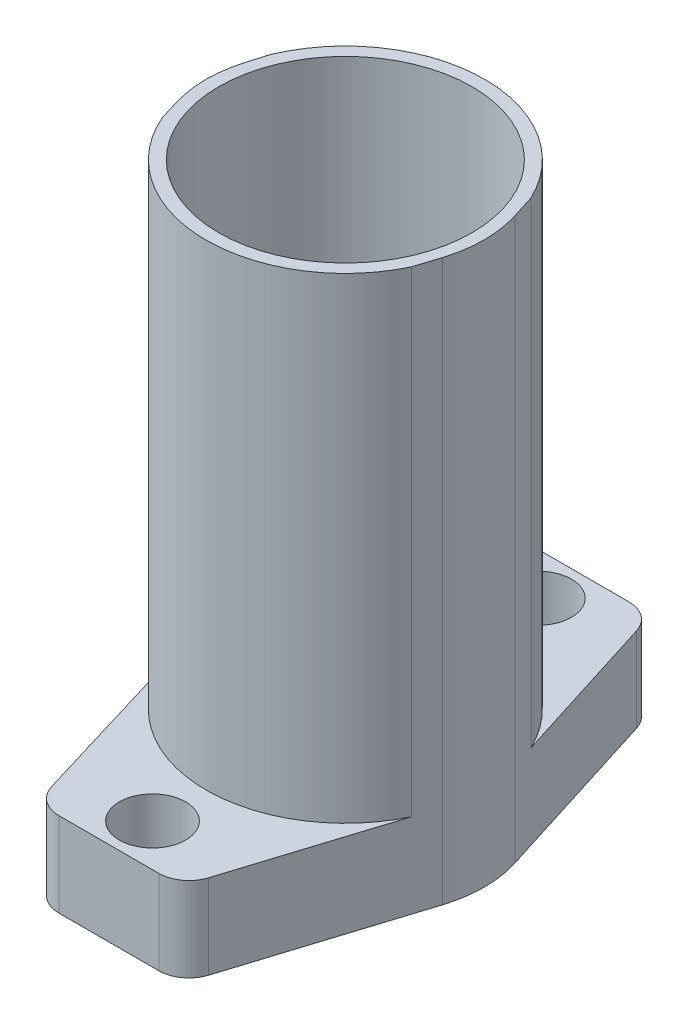
ISO-10303-21;
HEADER;
FILE_DESCRIPTION(('STEP AP214'),'2;1');
FILE_NAME('part.step','',(''),(''),'','','');
FILE_SCHEMA(('AUTOMOTIVE_DESIGN { 1 0 10303 214 1 1 1 1 }'));
ENDSEC;
DATA;
#1=APPLICATION_CONTEXT('core data for automotive mechanical design processes');
#2=APPLICATION_PROTOCOL_DEFINITION('international standard','automotive_design',2000,#1);
#3=PRODUCT_CONTEXT('',#1,'mechanical');
#4=PRODUCT('Part','Part','',(#3));
#5=PRODUCT_RELATED_PRODUCT_CATEGORY('part','',(#4));
#6=PRODUCT_DEFINITION_FORMATION('','',#4);
#7=PRODUCT_DEFINITION_CONTEXT('part definition',#1,'design');
#8=PRODUCT_DEFINITION('design','',#6,#7);
#9=PRODUCT_DEFINITION_SHAPE('','',#8);
#10=(LENGTH_UNIT() NAMED_UNIT(*) SI_UNIT(.MILLI.,.METRE.));
#11=(NAMED_UNIT(*) PLANE_ANGLE_UNIT() SI_UNIT($,.RADIAN.));
#12=(NAMED_UNIT(*) SI_UNIT($,.STERADIAN.) SOLID_ANGLE_UNIT());
#13=UNCERTAINTY_MEASURE_WITH_UNIT(LENGTH_MEASURE(1.E-05),#10,'distance_accuracy_value','');
#14=(GEOMETRIC_REPRESENTATION_CONTEXT(3) GLOBAL_UNCERTAINTY_ASSIGNED_CONTEXT((#13)) GLOBAL_UNIT_ASSIGNED_CONTEXT((#10,
#11,#12)) REPRESENTATION_CONTEXT('',''));
#15=CARTESIAN_POINT('',(0.,0.,0.));
#16=DIRECTION('',(0.,0.,1.));
#17=DIRECTION('',(1.,0.,0.));
#18=AXIS2_PLACEMENT_3D('',#15,#16,#17);
#19=CARTESIAN_POINT('',(0.,46.5,0.));
#20=DIRECTION('',(0.,-1.,0.));
#21=DIRECTION('',(0.,0.,-1.));
#22=AXIS2_PLACEMENT_3D('',#19,#20,#21);
#23=CYLINDRICAL_SURFACE('',#22,3.25);
#24=CARTESIAN_POINT('',(0.,25.,0.));
#25=DIRECTION('',(0.,1.,0.));
#26=DIRECTION('',(0.,0.,1.));
#27=AXIS2_PLACEMENT_3D('',#24,#25,#26);
#28=CIRCLE('',#27,3.25);
#29=CARTESIAN_POINT('',(0.,25.,-3.25));
#30=VERTEX_POINT('',#29);
#31=EDGE_CURVE('E284',#30,#30,#28,.F.);
#32=CARTESIAN_POINT('',(0.,15.,0.));
#33=DIRECTION('',(0.,-1.,0.));
#34=DIRECTION('',(0.,0.,-1.));
#35=AXIS2_PLACEMENT_3D('',#32,#33,#34);
#36=CIRCLE('',#35,3.25);
#37=CARTESIAN_POINT('',(0.,15.,-3.25));
#38=VERTEX_POINT('',#37);
#39=EDGE_CURVE('E227',#38,#38,#36,.T.);
#40=CARTESIAN_POINT('',(0.,25.,-3.25));
#41=CARTESIAN_POINT('',(0.,24.8958333333333,-3.25));
#42=CARTESIAN_POINT('',(0.,24.7916666666667,-3.25));
#43=CARTESIAN_POINT('',(0.,24.5833333333333,-3.25));
#44=CARTESIAN_POINT('',(0.,24.4791666666667,-3.25));
#45=CARTESIAN_POINT('',(0.,24.2708333333333,-3.25));
#46=CARTESIAN_POINT('',(0.,24.1666666666667,-3.25));
#47=CARTESIAN_POINT('',(0.,23.9583333333333,-3.25));
#48=CARTESIAN_POINT('',(0.,23.8541666666667,-3.25));
#49=CARTESIAN_POINT('',(0.,23.6458333333333,-3.25));
#50=CARTESIAN_POINT('',(0.,23.5416666666667,-3.25));
#51=CARTESIAN_POINT('',(0.,23.3333333333333,-3.25));
#52=CARTESIAN_POINT('',(0.,23.2291666666667,-3.25));
#53=CARTESIAN_POINT('',(0.,23.0208333333333,-3.25));
#54=CARTESIAN_POINT('',(0.,22.9166666666667,-3.25));
#55=CARTESIAN_POINT('',(0.,22.7083333333333,-3.25));
#56=CARTESIAN_POINT('',(0.,22.6041666666667,-3.25));
#57=CARTESIAN_POINT('',(0.,22.3958333333333,-3.25));
#58=CARTESIAN_POINT('',(0.,22.2916666666667,-3.25));
#59=CARTESIAN_POINT('',(0.,22.0833333333333,-3.25));
#60=CARTESIAN_POINT('',(0.,21.9791666666667,-3.25));
#61=CARTESIAN_POINT('',(0.,21.7708333333333,-3.25));
#62=CARTESIAN_POINT('',(0.,21.6666666666667,-3.25));
#63=CARTESIAN_POINT('',(0.,21.4583333333333,-3.25));
#64=CARTESIAN_POINT('',(0.,21.3541666666667,-3.25));
#65=CARTESIAN_POINT('',(0.,21.1458333333333,-3.25));
#66=CARTESIAN_POINT('',(0.,21.0416666666667,-3.25));
#67=CARTESIAN_POINT('',(0.,20.8333333333333,-3.25));
#68=CARTESIAN_POINT('',(0.,20.7291666666667,-3.25));
#69=CARTESIAN_POINT('',(0.,20.5208333333333,-3.25));
#70=CARTESIAN_POINT('',(0.,20.4166666666667,-3.25));
#71=CARTESIAN_POINT('',(0.,20.2083333333333,-3.25));
#72=CARTESIAN_POINT('',(0.,20.1041666666667,-3.25));
#73=CARTESIAN_POINT('',(0.,19.8958333333333,-3.25));
#74=CARTESIAN_POINT('',(0.,19.7916666666667,-3.25));
#75=CARTESIAN_POINT('',(0.,19.5833333333333,-3.25));
#76=CARTESIAN_POINT('',(0.,19.4791666666667,-3.25));
#77=CARTESIAN_POINT('',(0.,19.2708333333333,-3.25));
#78=CARTESIAN_POINT('',(0.,19.1666666666667,-3.25));
#79=CARTESIAN_POINT('',(0.,18.9583333333333,-3.25));
#80=CARTESIAN_POINT('',(0.,18.8541666666667,-3.25));
#81=CARTESIAN_POINT('',(0.,18.6458333333333,-3.25));
#82=CARTESIAN_POINT('',(0.,18.5416666666667,-3.25));
#83=CARTESIAN_POINT('',(0.,18.3333333333333,-3.25));
#84=CARTESIAN_POINT('',(0.,18.2291666666667,-3.25));
#85=CARTESIAN_POINT('',(0.,18.0208333333333,-3.25));
#86=CARTESIAN_POINT('',(0.,17.9166666666667,-3.25));
#87=CARTESIAN_POINT('',(0.,17.7083333333333,-3.25));
#88=CARTESIAN_POINT('',(0.,17.6041666666667,-3.25));
#89=CARTESIAN_POINT('',(0.,17.3958333333333,-3.25));
#90=CARTESIAN_POINT('',(0.,17.2916666666667,-3.25));
#91=CARTESIAN_POINT('',(0.,17.0833333333333,-3.25));
#92=CARTESIAN_POINT('',(0.,16.9791666666667,-3.25));
#93=CARTESIAN_POINT('',(0.,16.7708333333333,-3.25));
#94=CARTESIAN_POINT('',(0.,16.6666666666667,-3.25));
#95=CARTESIAN_POINT('',(0.,16.4583333333333,-3.25));
#96=CARTESIAN_POINT('',(0.,16.3541666666667,-3.25));
#97=CARTESIAN_POINT('',(0.,16.1458333333333,-3.25));
#98=CARTESIAN_POINT('',(0.,16.0416666666667,-3.25));
#99=CARTESIAN_POINT('',(0.,15.8333333333333,-3.25));
#100=CARTESIAN_POINT('',(0.,15.7291666666667,-3.25));
#101=CARTESIAN_POINT('',(0.,15.5208333333333,-3.25));
#102=CARTESIAN_POINT('',(0.,15.4166666666667,-3.25));
#103=CARTESIAN_POINT('',(0.,15.2083333333333,-3.25));
#104=CARTESIAN_POINT('',(0.,15.1041666666667,-3.25));
#105=CARTESIAN_POINT('',(0.,15.,-3.25));
#106=B_SPLINE_CURVE_WITH_KNOTS('',3,(#40,#41,#42,#43,#44,#45,#46,#47,#48,#49,#50,#51,#52,#53,
#54,#55,#56,#57,#58,#59,#60,#61,#62,#63,#64,#65,#66,#67,#68,#69,#70,#71,#72,#73,#74,#75,#76,#77,
#78,#79,#80,#81,#82,#83,#84,#85,#86,#87,#88,#89,#90,#91,#92,#93,#94,#95,#96,#97,#98,#99,#100,
#101,#102,#103,#104,#105),.UNSPECIFIED.,.F.,.F.,(4,2,2,2,2,2,2,2,2,2,2,2,2,2,2,2,2,2,2,2,2,2,2,
2,2,2,2,2,2,2,2,2,4),(0.,0.3125,0.625000000000001,0.937500000000001,1.25,1.5625,1.875,2.1875,
2.5,2.8125,3.125,3.4375,3.75,4.0625,4.375,4.6875,5.,5.3125,5.625,5.9375,6.25,6.5625,6.875,
7.1875,7.5,7.8125,8.125,8.43749999999999,8.74999999999999,9.06249999999999,9.37499999999999,
9.68749999999999,9.99999999999999),.UNSPECIFIED.);
#107=EDGE_CURVE('BSEAM68',#30,#38,#106,.T.);
#108=ORIENTED_EDGE('',*,*,#31,.F.);
#109=ORIENTED_EDGE('',*,*,#39,.T.);
#110=ORIENTED_EDGE('',*,*,#107,.T.);
#111=ORIENTED_EDGE('',*,*,#107,.F.);
#112=EDGE_LOOP('',(#108,#110,#109,#111));
#113=FACE_BOUND('',#112,.T.);
#114=ADVANCED_FACE('F68',(#113),#23,.F.);
#115=CARTESIAN_POINT('',(1.51586557407311,46.5,0.));
#116=DIRECTION('',(0.,-1.,0.));
#117=DIRECTION('',(0.,0.,-1.));
#118=AXIS2_PLACEMENT_3D('',#115,#116,#117);
#119=PLANE('',#118);
#120=CARTESIAN_POINT('',(0.,46.5,0.));
#121=DIRECTION('',(0.,1.,0.));
#122=DIRECTION('',(0.,0.,1.));
#123=AXIS2_PLACEMENT_3D('',#120,#121,#122);
#124=CIRCLE('',#123,10.5);
#125=CARTESIAN_POINT('',(0.,46.5,10.5));
#126=VERTEX_POINT('',#125);
#127=EDGE_CURVE('E281',#126,#126,#124,.T.);
#128=ORIENTED_EDGE('',*,*,#127,.F.);
#129=EDGE_LOOP('',(#128));
#130=FACE_BOUND('',#129,.T.);
#131=CARTESIAN_POINT('',(0.,46.5,0.));
#132=DIRECTION('',(0.,1.,0.));
#133=DIRECTION('',(0.,0.,1.));
#134=AXIS2_PLACEMENT_3D('',#131,#132,#133);
#135=CIRCLE('',#134,11.5541086192597);
#136=CARTESIAN_POINT('',(-10.6400392007414,46.5,4.50410832377919));
#137=VERTEX_POINT('',#136);
#138=CARTESIAN_POINT('',(10.4433830286858,46.5,4.94299270703569));
#139=VERTEX_POINT('',#138);
#140=EDGE_CURVE('E230',#137,#139,#135,.T.);
#141=ORIENTED_EDGE('',*,*,#140,.T.);
#142=DIRECTION('',(0.300371837042586,0.,-0.953822184430443));
#143=VECTOR('',#142,1.);
#144=CARTESIAN_POINT('',(5.85917950123169,46.5,19.5));
#145=LINE('',#144,#143);
#146=CARTESIAN_POINT('',(11.0540874183775,46.5,3.0037183704259));
#147=VERTEX_POINT('',#146);
#148=EDGE_CURVE('E264',#139,#147,#145,.T.);
#149=ORIENTED_EDGE('',*,*,#148,.T.);
#150=CARTESIAN_POINT('',(1.51586557407311,46.5,0.));
#151=DIRECTION('',(0.,1.,0.));
#152=DIRECTION('',(0.,0.,-1.));
#153=AXIS2_PLACEMENT_3D('',#150,#151,#152);
#154=CIRCLE('',#153,10.);
#155=CARTESIAN_POINT('',(11.0540874183775,46.5,-3.0037183704259));
#156=VERTEX_POINT('',#155);
#157=EDGE_CURVE('E242',#147,#156,#154,.T.);
#158=ORIENTED_EDGE('',*,*,#157,.T.);
#159=DIRECTION('',(-0.300371837042586,0.,-0.953822184430443));
#160=VECTOR('',#159,1.);
#161=CARTESIAN_POINT('',(5.85917950123169,46.5,-19.5));
#162=LINE('',#161,#160);
#163=CARTESIAN_POINT('',(10.4433830286858,46.5,-4.94299270703569));
#164=VERTEX_POINT('',#163);
#165=EDGE_CURVE('E245',#156,#164,#162,.T.);
#166=ORIENTED_EDGE('',*,*,#165,.T.);
#167=CARTESIAN_POINT('',(0.,46.5,0.));
#168=DIRECTION('',(0.,1.,0.));
#169=DIRECTION('',(0.,0.,1.));
#170=AXIS2_PLACEMENT_3D('',#167,#168,#169);
#171=CIRCLE('',#170,11.5541086192597);
#172=CARTESIAN_POINT('',(-10.6400392007414,46.5,-4.50410832377919));
#173=VERTEX_POINT('',#172);
#174=EDGE_CURVE('E295',#164,#173,#171,.T.);
#175=ORIENTED_EDGE('',*,*,#174,.T.);
#176=DIRECTION('',(-0.289049390334215,0.,0.957314185598134));
#177=VECTOR('',#176,1.);
#178=CARTESIAN_POINT('',(-6.11221185655418,46.5,-19.5));
#179=LINE('',#178,#177);
#180=CARTESIAN_POINT('',(-11.127250475241,46.5,-2.89049390334218));
#181=VERTEX_POINT('',#180);
#182=EDGE_CURVE('E271',#173,#181,#179,.T.);
#183=ORIENTED_EDGE('',*,*,#182,.T.);
#184=CARTESIAN_POINT('',(-1.55410861925967,46.5,0.));
#185=DIRECTION('',(0.,1.,0.));
#186=DIRECTION('',(0.,0.,1.));
#187=AXIS2_PLACEMENT_3D('',#184,#185,#186);
#188=CIRCLE('',#187,10.);
#189=CARTESIAN_POINT('',(-11.127250475241,46.5,2.89049390334218));
#190=VERTEX_POINT('',#189);
#191=EDGE_CURVE('E269',#181,#190,#188,.T.);
#192=ORIENTED_EDGE('',*,*,#191,.T.);
#193=DIRECTION('',(0.289049390334215,0.,0.957314185598134));
#194=VECTOR('',#193,1.);
#195=CARTESIAN_POINT('',(-6.11221185655418,46.5,19.5));
#196=LINE('',#195,#194);
#197=EDGE_CURVE('E266',#190,#137,#196,.T.);
#198=ORIENTED_EDGE('',*,*,#197,.T.);
#199=EDGE_LOOP('',(#141,#149,#158,#166,#175,#183,#192,#198));
#200=FACE_BOUND('',#199,.T.);
#201=ADVANCED_FACE('F354',(#130,#200),#119,.F.);
#202=CARTESIAN_POINT('',(5.85917950123169,46.5,-19.5));
#203=DIRECTION('',(-0.953822184430443,0.,0.300371837042586));
#204=DIRECTION('',(0.300371837042586,0.,0.953822184430443));
#205=AXIS2_PLACEMENT_3D('',#202,#203,#204);
#206=PLANE('',#205);
#207=DIRECTION('',(0.,-1.,0.));
#208=VECTOR('',#207,1.);
#209=CARTESIAN_POINT('',(6.40998603515535,46.5,-17.7509295926065));
#210=LINE('',#209,#208);
#211=CARTESIAN_POINT('',(6.40998603515535,0.,-17.7509295926065));
#212=VERTEX_POINT('',#211);
#213=CARTESIAN_POINT('',(6.40998603515535,7.,-17.7509295926065));
#214=VERTEX_POINT('',#213);
#215=EDGE_CURVE('E76',#212,#214,#210,.F.);
#216=ORIENTED_EDGE('',*,*,#215,.T.);
#217=DIRECTION('',(-0.300371837042586,0.,-0.953822184430443));
#218=VECTOR('',#217,1.);
#219=CARTESIAN_POINT('',(10.4433830286858,7.,-4.94299270703568));
#220=LINE('',#219,#218);
#221=CARTESIAN_POINT('',(10.4433830286858,7.,-4.94299270703568));
#222=VERTEX_POINT('',#221);
#223=EDGE_CURVE('E179',#222,#214,#220,.T.);
#224=ORIENTED_EDGE('',*,*,#223,.F.);
#225=DIRECTION('',(0.,1.,0.));
#226=VECTOR('',#225,1.);
#227=CARTESIAN_POINT('',(10.4433830286858,25.,-4.94299270703569));
#228=LINE('',#227,#226);
#229=EDGE_CURVE('E298',#222,#164,#228,.T.);
#230=ORIENTED_EDGE('',*,*,#229,.T.);
#231=ORIENTED_EDGE('',*,*,#165,.F.);
#232=DIRECTION('',(0.,-1.,0.));
#233=VECTOR('',#232,1.);
#234=CARTESIAN_POINT('',(11.0540874183775,46.5,-3.0037183704259));
#235=LINE('',#234,#233);
#236=CARTESIAN_POINT('',(11.0540874183775,0.,-3.0037183704259));
#237=VERTEX_POINT('',#236);
#238=EDGE_CURVE('E240',#156,#237,#235,.T.);
#239=ORIENTED_EDGE('',*,*,#238,.T.);
#240=DIRECTION('',(-0.300371837042586,0.,-0.953822184430443));
#241=VECTOR('',#240,1.);
#242=CARTESIAN_POINT('',(5.85917950123169,0.,-19.5));
#243=LINE('',#242,#241);
#244=EDGE_CURVE('E202',#237,#212,#243,.T.);
#245=ORIENTED_EDGE('',*,*,#244,.T.);
#246=EDGE_LOOP('',(#216,#224,#230,#231,#239,#245));
#247=FACE_BOUND('',#246,.T.);
#248=ADVANCED_FACE('F199',(#247),#206,.F.);
#249=CARTESIAN_POINT('',(-6.11221185655418,46.5,-19.5));
#250=DIRECTION('',(0.,0.,1.));
#251=DIRECTION('',(1.,0.,0.));
#252=AXIS2_PLACEMENT_3D('',#249,#250,#251);
#253=PLANE('',#252);
#254=DIRECTION('',(0.,-1.,0.));
#255=VECTOR('',#254,1.);
#256=CARTESIAN_POINT('',(-4.2555836451442,46.5,-19.5));
#257=LINE('',#256,#255);
#258=CARTESIAN_POINT('',(-4.2555836451442,0.,-19.5));
#259=VERTEX_POINT('',#258);
#260=CARTESIAN_POINT('',(-4.2555836451442,7.00000000000002,-19.5));
#261=VERTEX_POINT('',#260);
#262=EDGE_CURVE('E203',#259,#261,#257,.F.);
#263=ORIENTED_EDGE('',*,*,#262,.T.);
#264=DIRECTION('',(-1.,0.,0.));
#265=VECTOR('',#264,1.);
#266=CARTESIAN_POINT('',(4.02543057407924,7.,-19.5));
#267=LINE('',#266,#265);
#268=CARTESIAN_POINT('',(4.02543057407924,7.,-19.5));
#269=VERTEX_POINT('',#268);
#270=EDGE_CURVE('E91',#269,#261,#267,.T.);
#271=ORIENTED_EDGE('',*,*,#270,.F.);
#272=DIRECTION('',(0.,-1.,0.));
#273=VECTOR('',#272,1.);
#274=CARTESIAN_POINT('',(4.02543057407924,46.5,-19.5));
#275=LINE('',#274,#273);
#276=CARTESIAN_POINT('',(4.02543057407924,0.,-19.5));
#277=VERTEX_POINT('',#276);
#278=EDGE_CURVE('E196',#269,#277,#275,.T.);
#279=ORIENTED_EDGE('',*,*,#278,.T.);
#280=DIRECTION('',(-1.,0.,0.));
#281=VECTOR('',#280,1.);
#282=CARTESIAN_POINT('',(-6.11221185655418,0.,-19.5));
#283=LINE('',#282,#281);
#284=EDGE_CURVE('E258',#277,#259,#283,.T.);
#285=ORIENTED_EDGE('',*,*,#284,.T.);
#286=EDGE_LOOP('',(#263,#271,#279,#285));
#287=FACE_BOUND('',#286,.T.);
#288=ADVANCED_FACE('F364',(#287),#253,.F.);
#289=CARTESIAN_POINT('',(-6.11221185655418,46.5,-19.5));
#290=DIRECTION('',(0.957314185598134,0.,0.289049390334215));
#291=DIRECTION('',(0.289049390334215,0.,-0.957314185598134));
#292=AXIS2_PLACEMENT_3D('',#289,#290,#291);
#293=PLANE('',#292);
#294=DIRECTION('',(0.,1.,0.));
#295=VECTOR('',#294,1.);
#296=CARTESIAN_POINT('',(-10.6400392007414,25.,-4.50410832377919));
#297=LINE('',#296,#295);
#298=CARTESIAN_POINT('',(-10.6400392007414,7.,-4.50410832377919));
#299=VERTEX_POINT('',#298);
#300=EDGE_CURVE('E285',#299,#173,#297,.T.);
#301=ORIENTED_EDGE('',*,*,#300,.F.);
#302=DIRECTION('',(-0.289049390334215,0.,0.957314185598134));
#303=VECTOR('',#302,1.);
#304=CARTESIAN_POINT('',(-6.64886910913953,7.,-17.7226234758355));
#305=LINE('',#304,#303);
#306=CARTESIAN_POINT('',(-6.64886910913953,7.,-17.7226234758355));
#307=VERTEX_POINT('',#306);
#308=EDGE_CURVE('E329',#307,#299,#305,.T.);
#309=ORIENTED_EDGE('',*,*,#308,.F.);
#310=DIRECTION('',(0.,-1.,0.));
#311=VECTOR('',#310,1.);
#312=CARTESIAN_POINT('',(-6.64886910913953,46.5,-17.7226234758355));
#313=LINE('',#312,#311);
#314=CARTESIAN_POINT('',(-6.64886910913953,0.,-17.7226234758355));
#315=VERTEX_POINT('',#314);
#316=EDGE_CURVE('E13',#307,#315,#313,.T.);
#317=ORIENTED_EDGE('',*,*,#316,.T.);
#318=DIRECTION('',(-0.289049390334215,0.,0.957314185598134));
#319=VECTOR('',#318,1.);
#320=CARTESIAN_POINT('',(-6.11221185655418,0.,-19.5));
#321=LINE('',#320,#319);
#322=CARTESIAN_POINT('',(-11.127250475241,0.,-2.89049390334218));
#323=VERTEX_POINT('',#322);
#324=EDGE_CURVE('E256',#315,#323,#321,.T.);
#325=ORIENTED_EDGE('',*,*,#324,.T.);
#326=DIRECTION('',(0.,-1.,0.));
#327=VECTOR('',#326,1.);
#328=CARTESIAN_POINT('',(-11.127250475241,46.5,-2.89049390334218));
#329=LINE('',#328,#327);
#330=EDGE_CURVE('E226',#181,#323,#329,.T.);
#331=ORIENTED_EDGE('',*,*,#330,.F.);
#332=ORIENTED_EDGE('',*,*,#182,.F.);
#333=EDGE_LOOP('',(#301,#309,#317,#325,#331,#332));
#334=FACE_BOUND('',#333,.T.);
#335=ADVANCED_FACE('F334',(#334),#293,.F.);
#336=CARTESIAN_POINT('',(-6.11221185655418,46.5,19.5));
#337=DIRECTION('',(0.957314185598134,0.,-0.289049390334215));
#338=DIRECTION('',(-0.289049390334215,0.,-0.957314185598134));
#339=AXIS2_PLACEMENT_3D('',#336,#337,#338);
#340=PLANE('',#339);
#341=DIRECTION('',(0.,-1.,0.));
#342=VECTOR('',#341,1.);
#343=CARTESIAN_POINT('',(-6.64886910913953,46.5,17.7226234758355));
#344=LINE('',#343,#342);
#345=CARTESIAN_POINT('',(-6.64886910913953,0.,17.7226234758355));
#346=VERTEX_POINT('',#345);
#347=CARTESIAN_POINT('',(-6.64886910913953,7.,17.7226234758355));
#348=VERTEX_POINT('',#347);
#349=EDGE_CURVE('E210',#346,#348,#344,.F.);
#350=ORIENTED_EDGE('',*,*,#349,.T.);
#351=DIRECTION('',(0.289049390334215,0.,0.957314185598134));
#352=VECTOR('',#351,1.);
#353=CARTESIAN_POINT('',(-10.6400392007414,7.,4.50410832377919));
#354=LINE('',#353,#352);
#355=CARTESIAN_POINT('',(-10.6400392007414,7.,4.50410832377919));
#356=VERTEX_POINT('',#355);
#357=EDGE_CURVE('E316',#356,#348,#354,.T.);
#358=ORIENTED_EDGE('',*,*,#357,.F.);
#359=DIRECTION('',(0.,1.,0.));
#360=VECTOR('',#359,1.);
#361=CARTESIAN_POINT('',(-10.6400392007414,25.,4.50410832377919));
#362=LINE('',#361,#360);
#363=EDGE_CURVE('E290',#356,#137,#362,.T.);
#364=ORIENTED_EDGE('',*,*,#363,.T.);
#365=ORIENTED_EDGE('',*,*,#197,.F.);
#366=DIRECTION('',(0.,-1.,0.));
#367=VECTOR('',#366,1.);
#368=CARTESIAN_POINT('',(-11.127250475241,46.5,2.89049390334218));
#369=LINE('',#368,#367);
#370=CARTESIAN_POINT('',(-11.127250475241,0.,2.89049390334218));
#371=VERTEX_POINT('',#370);
#372=EDGE_CURVE('E234',#190,#371,#369,.T.);
#373=ORIENTED_EDGE('',*,*,#372,.T.);
#374=DIRECTION('',(0.289049390334215,0.,0.957314185598134));
#375=VECTOR('',#374,1.);
#376=CARTESIAN_POINT('',(-6.11221185655418,0.,19.5));
#377=LINE('',#376,#375);
#378=EDGE_CURVE('E251',#371,#346,#377,.T.);
#379=ORIENTED_EDGE('',*,*,#378,.T.);
#380=EDGE_LOOP('',(#350,#358,#364,#365,#373,#379));
#381=FACE_BOUND('',#380,.T.);
#382=ADVANCED_FACE('F371',(#381),#340,.F.);
#383=CARTESIAN_POINT('',(-6.11221185655418,46.5,19.5));
#384=DIRECTION('',(0.,0.,-1.));
#385=DIRECTION('',(-1.,0.,0.));
#386=AXIS2_PLACEMENT_3D('',#383,#384,#385);
#387=PLANE('',#386);
#388=DIRECTION('',(0.,-1.,0.));
#389=VECTOR('',#388,1.);
#390=CARTESIAN_POINT('',(4.02543057407924,46.5,19.5));
#391=LINE('',#390,#389);
#392=CARTESIAN_POINT('',(4.02543057407924,0.,19.5));
#393=VERTEX_POINT('',#392);
#394=CARTESIAN_POINT('',(4.02543057407924,7.00000000000001,19.5));
#395=VERTEX_POINT('',#394);
#396=EDGE_CURVE('E223',#393,#395,#391,.F.);
#397=ORIENTED_EDGE('',*,*,#396,.T.);
#398=DIRECTION('',(1.,0.,0.));
#399=VECTOR('',#398,1.);
#400=CARTESIAN_POINT('',(-4.2555836451442,7.,19.5));
#401=LINE('',#400,#399);
#402=CARTESIAN_POINT('',(-4.2555836451442,7.,19.5));
#403=VERTEX_POINT('',#402);
#404=EDGE_CURVE('E83',#403,#395,#401,.T.);
#405=ORIENTED_EDGE('',*,*,#404,.F.);
#406=DIRECTION('',(0.,-1.,0.));
#407=VECTOR('',#406,1.);
#408=CARTESIAN_POINT('',(-4.2555836451442,46.5,19.5));
#409=LINE('',#408,#407);
#410=CARTESIAN_POINT('',(-4.2555836451442,0.,19.5));
#411=VERTEX_POINT('',#410);
#412=EDGE_CURVE('E221',#403,#411,#409,.T.);
#413=ORIENTED_EDGE('',*,*,#412,.T.);
#414=DIRECTION('',(1.,0.,0.));
#415=VECTOR('',#414,1.);
#416=CARTESIAN_POINT('',(-6.11221185655418,0.,19.5));
#417=LINE('',#416,#415);
#418=EDGE_CURVE('E248',#411,#393,#417,.T.);
#419=ORIENTED_EDGE('',*,*,#418,.T.);
#420=EDGE_LOOP('',(#397,#405,#413,#419));
#421=FACE_BOUND('',#420,.T.);
#422=ADVANCED_FACE('F399',(#421),#387,.F.);
#423=CARTESIAN_POINT('',(5.85917950123169,46.5,19.5));
#424=DIRECTION('',(-0.953822184430443,0.,-0.300371837042586));
#425=DIRECTION('',(-0.300371837042586,0.,0.953822184430443));
#426=AXIS2_PLACEMENT_3D('',#423,#424,#425);
#427=PLANE('',#426);
#428=DIRECTION('',(0.,1.,0.));
#429=VECTOR('',#428,1.);
#430=CARTESIAN_POINT('',(10.4433830286858,25.,4.94299270703569));
#431=LINE('',#430,#429);
#432=CARTESIAN_POINT('',(10.4433830286858,7.,4.94299270703569));
#433=VERTEX_POINT('',#432);
#434=EDGE_CURVE('E293',#433,#139,#431,.T.);
#435=ORIENTED_EDGE('',*,*,#434,.F.);
#436=DIRECTION('',(0.300371837042586,0.,-0.953822184430443));
#437=VECTOR('',#436,1.);
#438=CARTESIAN_POINT('',(6.40998603515535,7.,17.7509295926065));
#439=LINE('',#438,#437);
#440=CARTESIAN_POINT('',(6.40998603515535,7.,17.7509295926065));
#441=VERTEX_POINT('',#440);
#442=EDGE_CURVE('E320',#441,#433,#439,.T.);
#443=ORIENTED_EDGE('',*,*,#442,.F.);
#444=DIRECTION('',(0.,-1.,0.));
#445=VECTOR('',#444,1.);
#446=CARTESIAN_POINT('',(6.40998603515535,46.5,17.7509295926065));
#447=LINE('',#446,#445);
#448=CARTESIAN_POINT('',(6.40998603515535,0.,17.7509295926065));
#449=VERTEX_POINT('',#448);
#450=EDGE_CURVE('E208',#441,#449,#447,.T.);
#451=ORIENTED_EDGE('',*,*,#450,.T.);
#452=DIRECTION('',(0.300371837042586,0.,-0.953822184430443));
#453=VECTOR('',#452,1.);
#454=CARTESIAN_POINT('',(5.85917950123169,0.,19.5));
#455=LINE('',#454,#453);
#456=CARTESIAN_POINT('',(11.0540874183775,0.,3.0037183704259));
#457=VERTEX_POINT('',#456);
#458=EDGE_CURVE('E246',#449,#457,#455,.T.);
#459=ORIENTED_EDGE('',*,*,#458,.T.);
#460=DIRECTION('',(0.,-1.,0.));
#461=VECTOR('',#460,1.);
#462=CARTESIAN_POINT('',(11.0540874183775,46.5,3.0037183704259));
#463=LINE('',#462,#461);
#464=EDGE_CURVE('E237',#147,#457,#463,.T.);
#465=ORIENTED_EDGE('',*,*,#464,.F.);
#466=ORIENTED_EDGE('',*,*,#148,.F.);
#467=EDGE_LOOP('',(#435,#443,#451,#459,#465,#466));
#468=FACE_BOUND('',#467,.T.);
#469=ADVANCED_FACE('F396',(#468),#427,.F.);
#470=CARTESIAN_POINT('',(0.,46.5,-16.));
#471=DIRECTION('',(0.,-1.,0.));
#472=DIRECTION('',(0.,0.,-1.));
#473=AXIS2_PLACEMENT_3D('',#470,#471,#472);
#474=CYLINDRICAL_SURFACE('',#473,2.75);
#475=CARTESIAN_POINT('',(0.,7.,-16.));
#476=DIRECTION('',(0.,-1.,0.));
#477=DIRECTION('',(0.,0.,-1.));
#478=AXIS2_PLACEMENT_3D('',#475,#476,#477);
#479=CIRCLE('',#478,2.75);
#480=CARTESIAN_POINT('',(0.,7.,-18.75));
#481=VERTEX_POINT('',#480);
#482=EDGE_CURVE('E311',#481,#481,#479,.T.);
#483=CARTESIAN_POINT('',(0.,0.,-16.));
#484=DIRECTION('',(0.,1.,0.));
#485=DIRECTION('',(0.,0.,1.));
#486=AXIS2_PLACEMENT_3D('',#483,#484,#485);
#487=CIRCLE('',#486,2.75);
#488=CARTESIAN_POINT('',(0.,0.,-18.75));
#489=VERTEX_POINT('',#488);
#490=EDGE_CURVE('E262',#489,#489,#487,.T.);
#491=CARTESIAN_POINT('',(0.,7.,-18.75));
#492=CARTESIAN_POINT('',(0.,6.92708333333333,-18.75));
#493=CARTESIAN_POINT('',(0.,6.85416666666666,-18.75));
#494=CARTESIAN_POINT('',(0.,6.70833333333333,-18.75));
#495=CARTESIAN_POINT('',(0.,6.63541666666666,-18.75));
#496=CARTESIAN_POINT('',(0.,6.48958333333333,-18.75));
#497=CARTESIAN_POINT('',(0.,6.41666666666667,-18.75));
#498=CARTESIAN_POINT('',(0.,6.27083333333333,-18.75));
#499=CARTESIAN_POINT('',(0.,6.19791666666667,-18.75));
#500=CARTESIAN_POINT('',(0.,6.05208333333333,-18.75));
#501=CARTESIAN_POINT('',(0.,5.97916666666666,-18.75));
#502=CARTESIAN_POINT('',(0.,5.83333333333333,-18.75));
#503=CARTESIAN_POINT('',(0.,5.76041666666666,-18.75));
#504=CARTESIAN_POINT('',(0.,5.61458333333333,-18.75));
#505=CARTESIAN_POINT('',(0.,5.54166666666667,-18.75));
#506=CARTESIAN_POINT('',(0.,5.39583333333333,-18.75));
#507=CARTESIAN_POINT('',(0.,5.32291666666667,-18.75));
#508=CARTESIAN_POINT('',(0.,5.17708333333333,-18.75));
#509=CARTESIAN_POINT('',(0.,5.10416666666666,-18.75));
#510=CARTESIAN_POINT('',(0.,4.95833333333333,-18.75));
#511=CARTESIAN_POINT('',(0.,4.88541666666666,-18.75));
#512=CARTESIAN_POINT('',(0.,4.73958333333333,-18.75));
#513=CARTESIAN_POINT('',(0.,4.66666666666667,-18.75));
#514=CARTESIAN_POINT('',(0.,4.52083333333333,-18.75));
#515=CARTESIAN_POINT('',(0.,4.44791666666667,-18.75));
#516=CARTESIAN_POINT('',(0.,4.30208333333333,-18.75));
#517=CARTESIAN_POINT('',(0.,4.22916666666666,-18.75));
#518=CARTESIAN_POINT('',(0.,4.08333333333333,-18.75));
#519=CARTESIAN_POINT('',(0.,4.01041666666666,-18.75));
#520=CARTESIAN_POINT('',(0.,3.86458333333333,-18.75));
#521=CARTESIAN_POINT('',(0.,3.79166666666667,-18.75));
#522=CARTESIAN_POINT('',(0.,3.64583333333333,-18.75));
#523=CARTESIAN_POINT('',(0.,3.57291666666666,-18.75));
#524=CARTESIAN_POINT('',(0.,3.42708333333333,-18.75));
#525=CARTESIAN_POINT('',(0.,3.35416666666666,-18.75));
#526=CARTESIAN_POINT('',(0.,3.20833333333333,-18.75));
#527=CARTESIAN_POINT('',(0.,3.13541666666666,-18.75));
#528=CARTESIAN_POINT('',(0.,2.98958333333333,-18.75));
#529=CARTESIAN_POINT('',(0.,2.91666666666666,-18.75));
#530=CARTESIAN_POINT('',(0.,2.77083333333333,-18.75));
#531=CARTESIAN_POINT('',(0.,2.69791666666666,-18.75));
#532=CARTESIAN_POINT('',(0.,2.55208333333333,-18.75));
#533=CARTESIAN_POINT('',(0.,2.47916666666666,-18.75));
#534=CARTESIAN_POINT('',(0.,2.33333333333333,-18.75));
#535=CARTESIAN_POINT('',(0.,2.26041666666666,-18.75));
#536=CARTESIAN_POINT('',(0.,2.11458333333333,-18.75));
#537=CARTESIAN_POINT('',(0.,2.04166666666666,-18.75));
#538=CARTESIAN_POINT('',(0.,1.89583333333333,-18.75));
#539=CARTESIAN_POINT('',(0.,1.82291666666666,-18.75));
#540=CARTESIAN_POINT('',(0.,1.67708333333333,-18.75));
#541=CARTESIAN_POINT('',(0.,1.60416666666666,-18.75));
#542=CARTESIAN_POINT('',(0.,1.45833333333333,-18.75));
#543=CARTESIAN_POINT('',(0.,1.38541666666666,-18.75));
#544=CARTESIAN_POINT('',(0.,1.23958333333333,-18.75));
#545=CARTESIAN_POINT('',(0.,1.16666666666666,-18.75));
#546=CARTESIAN_POINT('',(0.,1.02083333333333,-18.75));
#547=CARTESIAN_POINT('',(0.,0.947916666666662,-18.75));
#548=CARTESIAN_POINT('',(0.,0.802083333333326,-18.75));
#549=CARTESIAN_POINT('',(0.,0.729166666666658,-18.75));
#550=CARTESIAN_POINT('',(0.,0.583333333333325,-18.75));
#551=CARTESIAN_POINT('',(0.,0.510416666666659,-18.75));
#552=CARTESIAN_POINT('',(0.,0.364583333333328,-18.75));
#553=CARTESIAN_POINT('',(0.,0.291666666666662,-18.75));
#554=CARTESIAN_POINT('',(0.,0.145833333333329,-18.75));
#555=CARTESIAN_POINT('',(0.,0.0729166666666609,-18.75));
#556=CARTESIAN_POINT('',(0.,0.,-18.75));
#557=B_SPLINE_CURVE_WITH_KNOTS('',3,(#491,#492,#493,#494,#495,#496,#497,#498,#499,#500,#501,
#502,#503,#504,#505,#506,#507,#508,#509,#510,#511,#512,#513,#514,#515,#516,#517,#518,#519,#520,
#521,#522,#523,#524,#525,#526,#527,#528,#529,#530,#531,#532,#533,#534,#535,#536,#537,#538,#539,
#540,#541,#542,#543,#544,#545,#546,#547,#548,#549,#550,#551,#552,#553,#554,#555,#556),
.UNSPECIFIED.,.F.,.F.,(4,2,2,2,2,2,2,2,2,2,2,2,2,2,2,2,2,2,2,2,2,2,2,2,2,2,2,2,2,2,2,2,4),(0.,
0.218750000000004,0.4375,0.656249999999997,0.875000000000001,1.09375,1.3125,1.53125,1.75,
1.96875000000001,2.1875,2.40625,2.625,2.84375000000001,3.0625,3.28125,3.5,3.71875000000001,
3.9375,4.15625,4.375,4.59375000000001,4.8125,5.03125,5.25,5.46875000000001,5.68750000000001,
5.90625,6.12500000000001,6.34375000000001,6.56250000000001,6.78125,7.00000000000001),.UNSPECIFIED.);
#558=EDGE_CURVE('BSEAM385',#481,#489,#557,.T.);
#559=ORIENTED_EDGE('',*,*,#482,.F.);
#560=ORIENTED_EDGE('',*,*,#490,.F.);
#561=ORIENTED_EDGE('',*,*,#558,.T.);
#562=ORIENTED_EDGE('',*,*,#558,.F.);
#563=EDGE_LOOP('',(#559,#561,#560,#562));
#564=FACE_BOUND('',#563,.T.);
#565=ADVANCED_FACE('F385',(#564),#474,.F.);
#566=CARTESIAN_POINT('',(0.,46.5,16.));
#567=DIRECTION('',(0.,-1.,0.));
#568=DIRECTION('',(0.,0.,-1.));
#569=AXIS2_PLACEMENT_3D('',#566,#567,#568);
#570=CYLINDRICAL_SURFACE('',#569,2.75);
#571=CARTESIAN_POINT('',(0.,7.,16.));
#572=DIRECTION('',(0.,-1.,0.));
#573=DIRECTION('',(0.,0.,-1.));
#574=AXIS2_PLACEMENT_3D('',#571,#572,#573);
#575=CIRCLE('',#574,2.75);
#576=CARTESIAN_POINT('',(0.,7.,13.25));
#577=VERTEX_POINT('',#576);
#578=EDGE_CURVE('E306',#577,#577,#575,.T.);
#579=CARTESIAN_POINT('',(0.,0.,16.));
#580=DIRECTION('',(0.,1.,0.));
#581=DIRECTION('',(0.,0.,-1.));
#582=AXIS2_PLACEMENT_3D('',#579,#580,#581);
#583=CIRCLE('',#582,2.75);
#584=CARTESIAN_POINT('',(0.,0.,13.25));
#585=VERTEX_POINT('',#584);
#586=EDGE_CURVE('E277',#585,#585,#583,.T.);
#587=CARTESIAN_POINT('',(0.,7.,13.25));
#588=CARTESIAN_POINT('',(0.,6.92708333333333,13.25));
#589=CARTESIAN_POINT('',(0.,6.85416666666666,13.25));
#590=CARTESIAN_POINT('',(0.,6.70833333333333,13.25));
#591=CARTESIAN_POINT('',(0.,6.63541666666666,13.25));
#592=CARTESIAN_POINT('',(0.,6.48958333333333,13.25));
#593=CARTESIAN_POINT('',(0.,6.41666666666667,13.25));
#594=CARTESIAN_POINT('',(0.,6.27083333333333,13.25));
#595=CARTESIAN_POINT('',(0.,6.19791666666667,13.25));
#596=CARTESIAN_POINT('',(0.,6.05208333333333,13.25));
#597=CARTESIAN_POINT('',(0.,5.97916666666666,13.25));
#598=CARTESIAN_POINT('',(0.,5.83333333333333,13.25));
#599=CARTESIAN_POINT('',(0.,5.76041666666666,13.25));
#600=CARTESIAN_POINT('',(0.,5.61458333333333,13.25));
#601=CARTESIAN_POINT('',(0.,5.54166666666667,13.25));
#602=CARTESIAN_POINT('',(0.,5.39583333333333,13.25));
#603=CARTESIAN_POINT('',(0.,5.32291666666667,13.25));
#604=CARTESIAN_POINT('',(0.,5.17708333333333,13.25));
#605=CARTESIAN_POINT('',(0.,5.10416666666666,13.25));
#606=CARTESIAN_POINT('',(0.,4.95833333333333,13.25));
#607=CARTESIAN_POINT('',(0.,4.88541666666666,13.25));
#608=CARTESIAN_POINT('',(0.,4.73958333333333,13.25));
#609=CARTESIAN_POINT('',(0.,4.66666666666667,13.25));
#610=CARTESIAN_POINT('',(0.,4.52083333333333,13.25));
#611=CARTESIAN_POINT('',(0.,4.44791666666667,13.25));
#612=CARTESIAN_POINT('',(0.,4.30208333333333,13.25));
#613=CARTESIAN_POINT('',(0.,4.22916666666666,13.25));
#614=CARTESIAN_POINT('',(0.,4.08333333333333,13.25));
#615=CARTESIAN_POINT('',(0.,4.01041666666666,13.25));
#616=CARTESIAN_POINT('',(0.,3.86458333333333,13.25));
#617=CARTESIAN_POINT('',(0.,3.79166666666667,13.25));
#618=CARTESIAN_POINT('',(0.,3.64583333333333,13.25));
#619=CARTESIAN_POINT('',(0.,3.57291666666666,13.25));
#620=CARTESIAN_POINT('',(0.,3.42708333333333,13.25));
#621=CARTESIAN_POINT('',(0.,3.35416666666666,13.25));
#622=CARTESIAN_POINT('',(0.,3.20833333333333,13.25));
#623=CARTESIAN_POINT('',(0.,3.13541666666666,13.25));
#624=CARTESIAN_POINT('',(0.,2.98958333333333,13.25));
#625=CARTESIAN_POINT('',(0.,2.91666666666666,13.25));
#626=CARTESIAN_POINT('',(0.,2.77083333333333,13.25));
#627=CARTESIAN_POINT('',(0.,2.69791666666666,13.25));
#628=CARTESIAN_POINT('',(0.,2.55208333333333,13.25));
#629=CARTESIAN_POINT('',(0.,2.47916666666666,13.25));
#630=CARTESIAN_POINT('',(0.,2.33333333333333,13.25));
#631=CARTESIAN_POINT('',(0.,2.26041666666666,13.25));
#632=CARTESIAN_POINT('',(0.,2.11458333333333,13.25));
#633=CARTESIAN_POINT('',(0.,2.04166666666666,13.25));
#634=CARTESIAN_POINT('',(0.,1.89583333333333,13.25));
#635=CARTESIAN_POINT('',(0.,1.82291666666666,13.25));
#636=CARTESIAN_POINT('',(0.,1.67708333333333,13.25));
#637=CARTESIAN_POINT('',(0.,1.60416666666666,13.25));
#638=CARTESIAN_POINT('',(0.,1.45833333333333,13.25));
#639=CARTESIAN_POINT('',(0.,1.38541666666666,13.25));
#640=CARTESIAN_POINT('',(0.,1.23958333333333,13.25));
#641=CARTESIAN_POINT('',(0.,1.16666666666666,13.25));
#642=CARTESIAN_POINT('',(0.,1.02083333333333,13.25));
#643=CARTESIAN_POINT('',(0.,0.947916666666662,13.25));
#644=CARTESIAN_POINT('',(0.,0.802083333333326,13.25));
#645=CARTESIAN_POINT('',(0.,0.729166666666658,13.25));
#646=CARTESIAN_POINT('',(0.,0.583333333333325,13.25));
#647=CARTESIAN_POINT('',(0.,0.510416666666659,13.25));
#648=CARTESIAN_POINT('',(0.,0.364583333333328,13.25));
#649=CARTESIAN_POINT('',(0.,0.291666666666662,13.25));
#650=CARTESIAN_POINT('',(0.,0.145833333333329,13.25));
#651=CARTESIAN_POINT('',(0.,0.0729166666666609,13.25));
#652=CARTESIAN_POINT('',(0.,0.,13.25));
#653=B_SPLINE_CURVE_WITH_KNOTS('',3,(#587,#588,#589,#590,#591,#592,#593,#594,#595,#596,#597,
#598,#599,#600,#601,#602,#603,#604,#605,#606,#607,#608,#609,#610,#611,#612,#613,#614,#615,#616,
#617,#618,#619,#620,#621,#622,#623,#624,#625,#626,#627,#628,#629,#630,#631,#632,#633,#634,#635,
#636,#637,#638,#639,#640,#641,#642,#643,#644,#645,#646,#647,#648,#649,#650,#651,#652),
.UNSPECIFIED.,.F.,.F.,(4,2,2,2,2,2,2,2,2,2,2,2,2,2,2,2,2,2,2,2,2,2,2,2,2,2,2,2,2,2,2,2,4),(0.,
0.218750000000004,0.4375,0.656249999999997,0.875000000000001,1.09375,1.3125,1.53125,1.75,
1.96875000000001,2.1875,2.40625,2.625,2.84375000000001,3.0625,3.28125,3.5,3.71875000000001,
3.9375,4.15625,4.375,4.59375000000001,4.8125,5.03125,5.25,5.46875000000001,5.68750000000001,
5.90625,6.12500000000001,6.34375000000001,6.56250000000001,6.78125,7.00000000000001),.UNSPECIFIED.);
#654=EDGE_CURVE('BSEAM390',#577,#585,#653,.T.);
#655=ORIENTED_EDGE('',*,*,#578,.F.);
#656=ORIENTED_EDGE('',*,*,#586,.F.);
#657=ORIENTED_EDGE('',*,*,#654,.T.);
#658=ORIENTED_EDGE('',*,*,#654,.F.);
#659=EDGE_LOOP('',(#655,#657,#656,#658));
#660=FACE_BOUND('',#659,.T.);
#661=ADVANCED_FACE('F390',(#660),#570,.F.);
#662=CARTESIAN_POINT('',(1.51586557407311,0.,0.));
#663=DIRECTION('',(0.,-1.,0.));
#664=DIRECTION('',(0.,0.,-1.));
#665=AXIS2_PLACEMENT_3D('',#662,#663,#664);
#666=PLANE('',#665);
#667=CARTESIAN_POINT('',(0.,0.,0.));
#668=DIRECTION('',(0.,-1.,0.));
#669=DIRECTION('',(0.,0.,-1.));
#670=AXIS2_PLACEMENT_3D('',#667,#668,#669);
#671=CIRCLE('',#670,5.);
#672=CARTESIAN_POINT('',(0.,0.,-5.));
#673=VERTEX_POINT('',#672);
#674=EDGE_CURVE('E303',#673,#673,#671,.T.);
#675=ORIENTED_EDGE('',*,*,#674,.F.);
#676=EDGE_LOOP('',(#675));
#677=FACE_BOUND('',#676,.T.);
#678=ORIENTED_EDGE('',*,*,#490,.T.);
#679=EDGE_LOOP('',(#678));
#680=FACE_BOUND('',#679,.T.);
#681=ORIENTED_EDGE('',*,*,#418,.F.);
#682=CARTESIAN_POINT('',(-4.2555836451442,0.,17.));
#683=DIRECTION('',(0.,-1.,0.));
#684=DIRECTION('',(0.,0.,-1.));
#685=AXIS2_PLACEMENT_3D('',#682,#683,#684);
#686=CIRCLE('',#685,2.5);
#687=EDGE_CURVE('E213',#411,#346,#686,.T.);
#688=ORIENTED_EDGE('',*,*,#687,.T.);
#689=ORIENTED_EDGE('',*,*,#378,.F.);
#690=CARTESIAN_POINT('',(-1.55410861925967,0.,0.));
#691=DIRECTION('',(0.,1.,0.));
#692=DIRECTION('',(0.,0.,1.));
#693=AXIS2_PLACEMENT_3D('',#690,#691,#692);
#694=CIRCLE('',#693,10.);
#695=EDGE_CURVE('E254',#323,#371,#694,.T.);
#696=ORIENTED_EDGE('',*,*,#695,.F.);
#697=ORIENTED_EDGE('',*,*,#324,.F.);
#698=CARTESIAN_POINT('',(-4.2555836451442,0.,-17.));
#699=DIRECTION('',(0.,-1.,0.));
#700=DIRECTION('',(0.,0.,-1.));
#701=AXIS2_PLACEMENT_3D('',#698,#699,#700);
#702=CIRCLE('',#701,2.5);
#703=EDGE_CURVE('E219',#315,#259,#702,.T.);
#704=ORIENTED_EDGE('',*,*,#703,.T.);
#705=ORIENTED_EDGE('',*,*,#284,.F.);
#706=CARTESIAN_POINT('',(4.02543057407924,0.,-17.));
#707=DIRECTION('',(0.,-1.,0.));
#708=DIRECTION('',(0.,0.,-1.));
#709=AXIS2_PLACEMENT_3D('',#706,#707,#708);
#710=CIRCLE('',#709,2.5);
#711=EDGE_CURVE('E217',#277,#212,#710,.T.);
#712=ORIENTED_EDGE('',*,*,#711,.T.);
#713=ORIENTED_EDGE('',*,*,#244,.F.);
#714=CARTESIAN_POINT('',(1.51586557407311,0.,0.));
#715=DIRECTION('',(0.,1.,0.));
#716=DIRECTION('',(0.,0.,-1.));
#717=AXIS2_PLACEMENT_3D('',#714,#715,#716);
#718=CIRCLE('',#717,10.);
#719=EDGE_CURVE('E243',#457,#237,#718,.T.);
#720=ORIENTED_EDGE('',*,*,#719,.F.);
#721=ORIENTED_EDGE('',*,*,#458,.F.);
#722=CARTESIAN_POINT('',(4.02543057407924,0.,17.));
#723=DIRECTION('',(0.,-1.,0.));
#724=DIRECTION('',(0.,0.,-1.));
#725=AXIS2_PLACEMENT_3D('',#722,#723,#724);
#726=CIRCLE('',#725,2.5);
#727=EDGE_CURVE('E215',#449,#393,#726,.T.);
#728=ORIENTED_EDGE('',*,*,#727,.T.);
#729=EDGE_LOOP('',(#681,#688,#689,#696,#697,#704,#705,#712,#713,#720,#721,#728));
#730=FACE_BOUND('',#729,.T.);
#731=ORIENTED_EDGE('',*,*,#586,.T.);
#732=EDGE_LOOP('',(#731));
#733=FACE_BOUND('',#732,.T.);
#734=ADVANCED_FACE('F344',(#677,#680,#730,#733),#666,.T.);
#735=CARTESIAN_POINT('',(-1.55410861925967,46.5,0.));
#736=DIRECTION('',(0.,-1.,0.));
#737=DIRECTION('',(0.,0.,-1.));
#738=AXIS2_PLACEMENT_3D('',#735,#736,#737);
#739=CYLINDRICAL_SURFACE('',#738,10.);
#740=ORIENTED_EDGE('',*,*,#695,.T.);
#741=ORIENTED_EDGE('',*,*,#372,.F.);
#742=ORIENTED_EDGE('',*,*,#191,.F.);
#743=ORIENTED_EDGE('',*,*,#330,.T.);
#744=EDGE_LOOP('',(#740,#741,#742,#743));
#745=FACE_BOUND('',#744,.T.);
#746=ADVANCED_FACE('F350',(#745),#739,.T.);
#747=CARTESIAN_POINT('',(1.51586557407311,46.5,0.));
#748=DIRECTION('',(0.,-1.,0.));
#749=DIRECTION('',(0.,0.,-1.));
#750=AXIS2_PLACEMENT_3D('',#747,#748,#749);
#751=CYLINDRICAL_SURFACE('',#750,10.);
#752=ORIENTED_EDGE('',*,*,#719,.T.);
#753=ORIENTED_EDGE('',*,*,#238,.F.);
#754=ORIENTED_EDGE('',*,*,#157,.F.);
#755=ORIENTED_EDGE('',*,*,#464,.T.);
#756=EDGE_LOOP('',(#752,#753,#754,#755));
#757=FACE_BOUND('',#756,.T.);
#758=ADVANCED_FACE('F392',(#757),#751,.T.);
#759=CARTESIAN_POINT('',(0.,25.,0.));
#760=DIRECTION('',(0.,1.,0.));
#761=DIRECTION('',(0.,0.,1.));
#762=AXIS2_PLACEMENT_3D('',#759,#760,#761);
#763=CYLINDRICAL_SURFACE('',#762,11.5541086192597);
#764=ORIENTED_EDGE('',*,*,#140,.F.);
#765=ORIENTED_EDGE('',*,*,#363,.F.);
#766=CARTESIAN_POINT('',(0.,7.,0.));
#767=DIRECTION('',(0.,-1.,0.));
#768=DIRECTION('',(0.,0.,-1.));
#769=AXIS2_PLACEMENT_3D('',#766,#767,#768);
#770=CIRCLE('',#769,11.5541086192597);
#771=EDGE_CURVE('E189',#433,#356,#770,.T.);
#772=ORIENTED_EDGE('',*,*,#771,.F.);
#773=ORIENTED_EDGE('',*,*,#434,.T.);
#774=EDGE_LOOP('',(#764,#765,#772,#773));
#775=FACE_BOUND('',#774,.T.);
#776=ADVANCED_FACE('F395',(#775),#763,.T.);
#777=CARTESIAN_POINT('',(0.,25.,0.));
#778=DIRECTION('',(0.,1.,0.));
#779=DIRECTION('',(0.,0.,1.));
#780=AXIS2_PLACEMENT_3D('',#777,#778,#779);
#781=CYLINDRICAL_SURFACE('',#780,11.5541086192597);
#782=ORIENTED_EDGE('',*,*,#174,.F.);
#783=ORIENTED_EDGE('',*,*,#229,.F.);
#784=CARTESIAN_POINT('',(0.,7.,0.));
#785=DIRECTION('',(0.,-1.,0.));
#786=DIRECTION('',(0.,0.,-1.));
#787=AXIS2_PLACEMENT_3D('',#784,#785,#786);
#788=CIRCLE('',#787,11.5541086192597);
#789=EDGE_CURVE('E185',#299,#222,#788,.T.);
#790=ORIENTED_EDGE('',*,*,#789,.F.);
#791=ORIENTED_EDGE('',*,*,#300,.T.);
#792=EDGE_LOOP('',(#782,#783,#790,#791));
#793=FACE_BOUND('',#792,.T.);
#794=ADVANCED_FACE('F357',(#793),#781,.T.);
#795=CARTESIAN_POINT('',(0.,25.,0.));
#796=DIRECTION('',(0.,1.,0.));
#797=DIRECTION('',(0.,0.,1.));
#798=AXIS2_PLACEMENT_3D('',#795,#796,#797);
#799=CYLINDRICAL_SURFACE('',#798,10.5);
#800=CARTESIAN_POINT('',(0.,25.,0.));
#801=DIRECTION('',(0.,1.,0.));
#802=DIRECTION('',(0.,0.,1.));
#803=AXIS2_PLACEMENT_3D('',#800,#801,#802);
#804=CIRCLE('',#803,10.5);
#805=CARTESIAN_POINT('',(0.,25.,10.5));
#806=VERTEX_POINT('',#805);
#807=EDGE_CURVE('E280',#806,#806,#804,.T.);
#808=ORIENTED_EDGE('',*,*,#807,.F.);
#809=EDGE_LOOP('',(#808));
#810=FACE_BOUND('',#809,.T.);
#811=ORIENTED_EDGE('',*,*,#127,.T.);
#812=EDGE_LOOP('',(#811));
#813=FACE_BOUND('',#812,.T.);
#814=ADVANCED_FACE('F421',(#810,#813),#799,.F.);
#815=CARTESIAN_POINT('',(0.,25.,0.));
#816=DIRECTION('',(0.,1.,0.));
#817=DIRECTION('',(0.,0.,1.));
#818=AXIS2_PLACEMENT_3D('',#815,#816,#817);
#819=PLANE('',#818);
#820=ORIENTED_EDGE('',*,*,#31,.T.);
#821=EDGE_LOOP('',(#820));
#822=FACE_BOUND('',#821,.T.);
#823=ORIENTED_EDGE('',*,*,#807,.T.);
#824=EDGE_LOOP('',(#823));
#825=FACE_BOUND('',#824,.T.);
#826=ADVANCED_FACE('F425',(#822,#825),#819,.T.);
#827=CARTESIAN_POINT('',(0.,15.,0.));
#828=DIRECTION('',(0.,-1.,0.));
#829=DIRECTION('',(0.,0.,-1.));
#830=AXIS2_PLACEMENT_3D('',#827,#828,#829);
#831=CYLINDRICAL_SURFACE('',#830,5.);
#832=CARTESIAN_POINT('',(0.,15.,0.));
#833=DIRECTION('',(0.,-1.,0.));
#834=DIRECTION('',(0.,0.,-1.));
#835=AXIS2_PLACEMENT_3D('',#832,#833,#834);
#836=CIRCLE('',#835,5.);
#837=CARTESIAN_POINT('',(0.,15.,-5.));
#838=VERTEX_POINT('',#837);
#839=EDGE_CURVE('E231',#838,#838,#836,.T.);
#840=ORIENTED_EDGE('',*,*,#839,.F.);
#841=EDGE_LOOP('',(#840));
#842=FACE_BOUND('',#841,.T.);
#843=ORIENTED_EDGE('',*,*,#674,.T.);
#844=EDGE_LOOP('',(#843));
#845=FACE_BOUND('',#844,.T.);
#846=ADVANCED_FACE('F433',(#842,#845),#831,.F.);
#847=CARTESIAN_POINT('',(0.,15.,0.));
#848=DIRECTION('',(0.,-1.,0.));
#849=DIRECTION('',(0.,0.,-1.));
#850=AXIS2_PLACEMENT_3D('',#847,#848,#849);
#851=PLANE('',#850);
#852=ORIENTED_EDGE('',*,*,#39,.F.);
#853=EDGE_LOOP('',(#852));
#854=FACE_BOUND('',#853,.T.);
#855=ORIENTED_EDGE('',*,*,#839,.T.);
#856=EDGE_LOOP('',(#855));
#857=FACE_BOUND('',#856,.T.);
#858=ADVANCED_FACE('F441',(#854,#857),#851,.T.);
#859=CARTESIAN_POINT('',(-4.2555836451442,46.5,17.));
#860=DIRECTION('',(0.,-1.,0.));
#861=DIRECTION('',(0.,0.,-1.));
#862=AXIS2_PLACEMENT_3D('',#859,#860,#861);
#863=CYLINDRICAL_SURFACE('',#862,2.5);
#864=CARTESIAN_POINT('',(-4.2555836451442,7.,17.));
#865=DIRECTION('',(0.,-1.,0.));
#866=DIRECTION('',(0.,0.,-1.));
#867=AXIS2_PLACEMENT_3D('',#864,#865,#866);
#868=CIRCLE('',#867,2.5);
#869=EDGE_CURVE('E314',#348,#403,#868,.F.);
#870=ORIENTED_EDGE('',*,*,#869,.F.);
#871=ORIENTED_EDGE('',*,*,#349,.F.);
#872=ORIENTED_EDGE('',*,*,#687,.F.);
#873=ORIENTED_EDGE('',*,*,#412,.F.);
#874=EDGE_LOOP('',(#870,#871,#872,#873));
#875=FACE_BOUND('',#874,.T.);
#876=ADVANCED_FACE('F449',(#875),#863,.T.);
#877=CARTESIAN_POINT('',(4.02543057407924,46.5,17.));
#878=DIRECTION('',(0.,-1.,0.));
#879=DIRECTION('',(0.,0.,-1.));
#880=AXIS2_PLACEMENT_3D('',#877,#878,#879);
#881=CYLINDRICAL_SURFACE('',#880,2.5);
#882=CARTESIAN_POINT('',(4.02543057407924,7.,17.));
#883=DIRECTION('',(0.,-1.,0.));
#884=DIRECTION('',(0.,0.,-1.));
#885=AXIS2_PLACEMENT_3D('',#882,#883,#884);
#886=CIRCLE('',#885,2.5);
#887=EDGE_CURVE('E318',#395,#441,#886,.F.);
#888=ORIENTED_EDGE('',*,*,#887,.F.);
#889=ORIENTED_EDGE('',*,*,#396,.F.);
#890=ORIENTED_EDGE('',*,*,#727,.F.);
#891=ORIENTED_EDGE('',*,*,#450,.F.);
#892=EDGE_LOOP('',(#888,#889,#890,#891));
#893=FACE_BOUND('',#892,.T.);
#894=ADVANCED_FACE('F458',(#893),#881,.T.);
#895=CARTESIAN_POINT('',(4.02543057407924,46.5,-17.));
#896=DIRECTION('',(0.,-1.,0.));
#897=DIRECTION('',(0.,0.,-1.));
#898=AXIS2_PLACEMENT_3D('',#895,#896,#897);
#899=CYLINDRICAL_SURFACE('',#898,2.5);
#900=CARTESIAN_POINT('',(4.02543057407924,7.,-17.));
#901=DIRECTION('',(0.,-1.,0.));
#902=DIRECTION('',(0.,0.,-1.));
#903=AXIS2_PLACEMENT_3D('',#900,#901,#902);
#904=CIRCLE('',#903,2.5);
#905=EDGE_CURVE('E182',#214,#269,#904,.F.);
#906=ORIENTED_EDGE('',*,*,#905,.F.);
#907=ORIENTED_EDGE('',*,*,#215,.F.);
#908=ORIENTED_EDGE('',*,*,#711,.F.);
#909=ORIENTED_EDGE('',*,*,#278,.F.);
#910=EDGE_LOOP('',(#906,#907,#908,#909));
#911=FACE_BOUND('',#910,.T.);
#912=ADVANCED_FACE('F194',(#911),#899,.T.);
#913=CARTESIAN_POINT('',(-4.2555836451442,46.5,-17.));
#914=DIRECTION('',(0.,-1.,0.));
#915=DIRECTION('',(0.,0.,-1.));
#916=AXIS2_PLACEMENT_3D('',#913,#914,#915);
#917=CYLINDRICAL_SURFACE('',#916,2.5);
#918=CARTESIAN_POINT('',(-4.2555836451442,7.,-17.));
#919=DIRECTION('',(0.,-1.,0.));
#920=DIRECTION('',(0.,0.,-1.));
#921=AXIS2_PLACEMENT_3D('',#918,#919,#920);
#922=CIRCLE('',#921,2.5);
#923=EDGE_CURVE('E327',#261,#307,#922,.F.);
#924=ORIENTED_EDGE('',*,*,#923,.F.);
#925=ORIENTED_EDGE('',*,*,#262,.F.);
#926=ORIENTED_EDGE('',*,*,#703,.F.);
#927=ORIENTED_EDGE('',*,*,#316,.F.);
#928=EDGE_LOOP('',(#924,#925,#926,#927));
#929=FACE_BOUND('',#928,.T.);
#930=ADVANCED_FACE('F70',(#929),#917,.T.);
#931=CARTESIAN_POINT('',(1.51586557407311,7.,0.));
#932=DIRECTION('',(0.,-1.,0.));
#933=DIRECTION('',(0.,0.,-1.));
#934=AXIS2_PLACEMENT_3D('',#931,#932,#933);
#935=PLANE('',#934);
#936=ORIENTED_EDGE('',*,*,#482,.T.);
#937=EDGE_LOOP('',(#936));
#938=FACE_BOUND('',#937,.T.);
#939=ORIENTED_EDGE('',*,*,#789,.T.);
#940=ORIENTED_EDGE('',*,*,#223,.T.);
#941=ORIENTED_EDGE('',*,*,#905,.T.);
#942=ORIENTED_EDGE('',*,*,#270,.T.);
#943=ORIENTED_EDGE('',*,*,#923,.T.);
#944=ORIENTED_EDGE('',*,*,#308,.T.);
#945=EDGE_LOOP('',(#939,#940,#941,#942,#943,#944));
#946=FACE_BOUND('',#945,.T.);
#947=ADVANCED_FACE('F181',(#938,#946),#935,.F.);
#948=CARTESIAN_POINT('',(1.51586557407311,7.,0.));
#949=DIRECTION('',(0.,-1.,0.));
#950=DIRECTION('',(0.,0.,-1.));
#951=AXIS2_PLACEMENT_3D('',#948,#949,#950);
#952=PLANE('',#951);
#953=ORIENTED_EDGE('',*,*,#578,.T.);
#954=EDGE_LOOP('',(#953));
#955=FACE_BOUND('',#954,.T.);
#956=ORIENTED_EDGE('',*,*,#771,.T.);
#957=ORIENTED_EDGE('',*,*,#357,.T.);
#958=ORIENTED_EDGE('',*,*,#869,.T.);
#959=ORIENTED_EDGE('',*,*,#404,.T.);
#960=ORIENTED_EDGE('',*,*,#887,.T.);
#961=ORIENTED_EDGE('',*,*,#442,.T.);
#962=EDGE_LOOP('',(#956,#957,#958,#959,#960,#961));
#963=FACE_BOUND('',#962,.T.);
#964=ADVANCED_FACE('F505',(#955,#963),#952,.F.);
#965=CLOSED_SHELL('',(#114,#201,#248,#288,#335,#382,#422,#469,#565,#661,#734,#746,#758,#776,
#794,#814,#826,#846,#858,#876,#894,#912,#930,#947,#964));
#966=MANIFOLD_SOLID_BREP('B2',#965);
#967=ADVANCED_BREP_SHAPE_REPRESENTATION('',(#18,#966),#14);
#968=SHAPE_DEFINITION_REPRESENTATION(#9,#967);
ENDSEC;
END-ISO-10303-21;
